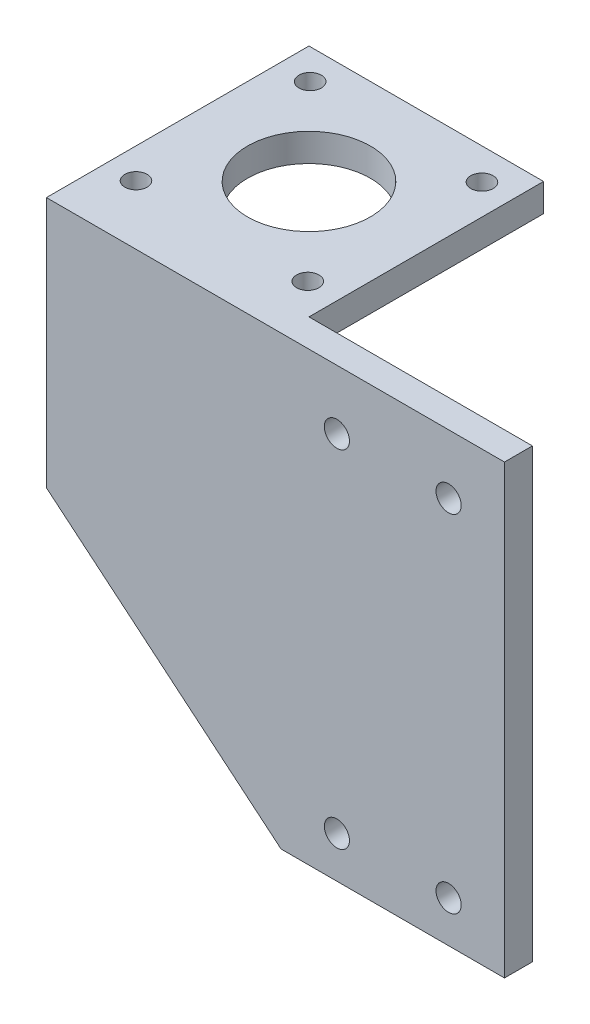
ISO-10303-21;
HEADER;
FILE_DESCRIPTION(('STEP AP214'),'2;1');
FILE_NAME('part.step','',(''),(''),'','','');
FILE_SCHEMA(('AUTOMOTIVE_DESIGN { 1 0 10303 214 1 1 1 1 }'));
ENDSEC;
DATA;
#1=APPLICATION_CONTEXT('core data for automotive mechanical design processes');
#2=APPLICATION_PROTOCOL_DEFINITION('international standard','automotive_design',2000,#1);
#3=PRODUCT_CONTEXT('',#1,'mechanical');
#4=PRODUCT('Part','Part','',(#3));
#5=PRODUCT_RELATED_PRODUCT_CATEGORY('part','',(#4));
#6=PRODUCT_DEFINITION_FORMATION('','',#4);
#7=PRODUCT_DEFINITION_CONTEXT('part definition',#1,'design');
#8=PRODUCT_DEFINITION('design','',#6,#7);
#9=PRODUCT_DEFINITION_SHAPE('','',#8);
#10=(LENGTH_UNIT() NAMED_UNIT(*) SI_UNIT(.MILLI.,.METRE.));
#11=(NAMED_UNIT(*) PLANE_ANGLE_UNIT() SI_UNIT($,.RADIAN.));
#12=(NAMED_UNIT(*) SI_UNIT($,.STERADIAN.) SOLID_ANGLE_UNIT());
#13=UNCERTAINTY_MEASURE_WITH_UNIT(LENGTH_MEASURE(1.E-05),#10,'distance_accuracy_value','');
#14=(GEOMETRIC_REPRESENTATION_CONTEXT(3) GLOBAL_UNCERTAINTY_ASSIGNED_CONTEXT((#13)) GLOBAL_UNIT_ASSIGNED_CONTEXT((#10,
#11,#12)) REPRESENTATION_CONTEXT('',''));
#15=CARTESIAN_POINT('',(0.,0.,0.));
#16=DIRECTION('',(0.,0.,1.));
#17=DIRECTION('',(1.,0.,0.));
#18=AXIS2_PLACEMENT_3D('',#15,#16,#17);
#19=CARTESIAN_POINT('',(0.,5.,0.));
#20=DIRECTION('',(0.,-1.,0.));
#21=DIRECTION('',(0.,0.,-1.));
#22=AXIS2_PLACEMENT_3D('',#19,#20,#21);
#23=PLANE('',#22);
#24=DIRECTION('',(0.,0.,-1.));
#25=VECTOR('',#24,1.);
#26=CARTESIAN_POINT('',(21.,5.,21.));
#27=LINE('',#26,#25);
#28=CARTESIAN_POINT('',(21.,5.,21.));
#29=VERTEX_POINT('',#28);
#30=CARTESIAN_POINT('',(21.,5.,-21.));
#31=VERTEX_POINT('',#30);
#32=EDGE_CURVE('E83',#29,#31,#27,.T.);
#33=ORIENTED_EDGE('',*,*,#32,.T.);
#34=DIRECTION('',(-1.,0.,0.));
#35=VECTOR('',#34,1.);
#36=CARTESIAN_POINT('',(-21.,5.,-21.));
#37=LINE('',#36,#35);
#38=CARTESIAN_POINT('',(-21.,5.,-21.));
#39=VERTEX_POINT('',#38);
#40=EDGE_CURVE('E50',#31,#39,#37,.T.);
#41=ORIENTED_EDGE('',*,*,#40,.T.);
#42=DIRECTION('',(0.,0.,1.));
#43=VECTOR('',#42,1.);
#44=CARTESIAN_POINT('',(-21.,5.,21.));
#45=LINE('',#44,#43);
#46=CARTESIAN_POINT('',(-21.,5.,26.));
#47=VERTEX_POINT('',#46);
#48=EDGE_CURVE('E91',#39,#47,#45,.T.);
#49=ORIENTED_EDGE('',*,*,#48,.T.);
#50=DIRECTION('',(-1.,0.,0.));
#51=VECTOR('',#50,1.);
#52=CARTESIAN_POINT('',(-21.,5.,26.));
#53=LINE('',#52,#51);
#54=CARTESIAN_POINT('',(61.,5.,26.));
#55=VERTEX_POINT('',#54);
#56=EDGE_CURVE('E153',#55,#47,#53,.T.);
#57=ORIENTED_EDGE('',*,*,#56,.F.);
#58=DIRECTION('',(0.,0.,-1.));
#59=VECTOR('',#58,1.);
#60=CARTESIAN_POINT('',(61.,5.,26.));
#61=LINE('',#60,#59);
#62=CARTESIAN_POINT('',(61.,5.,21.));
#63=VERTEX_POINT('',#62);
#64=EDGE_CURVE('E149',#55,#63,#61,.T.);
#65=ORIENTED_EDGE('',*,*,#64,.T.);
#66=DIRECTION('',(-1.,0.,0.));
#67=VECTOR('',#66,1.);
#68=CARTESIAN_POINT('',(21.,5.,21.));
#69=LINE('',#68,#67);
#70=EDGE_CURVE('E111',#63,#29,#69,.T.);
#71=ORIENTED_EDGE('',*,*,#70,.T.);
#72=EDGE_LOOP('',(#33,#41,#49,#57,#65,#71));
#73=FACE_BOUND('',#72,.T.);
#74=CARTESIAN_POINT('',(0.,5.,0.));
#75=DIRECTION('',(0.,1.,0.));
#76=DIRECTION('',(0.,0.,1.));
#77=AXIS2_PLACEMENT_3D('',#74,#75,#76);
#78=CIRCLE('',#77,11.);
#79=CARTESIAN_POINT('',(0.,5.,11.));
#80=VERTEX_POINT('',#79);
#81=EDGE_CURVE('E95',#80,#80,#78,.T.);
#82=ORIENTED_EDGE('',*,*,#81,.F.);
#83=EDGE_LOOP('',(#82));
#84=FACE_BOUND('',#83,.T.);
#85=CARTESIAN_POINT('',(-15.592519129157,5.,15.3780150606921));
#86=DIRECTION('',(0.,1.,0.));
#87=DIRECTION('',(0.,0.,1.));
#88=AXIS2_PLACEMENT_3D('',#85,#86,#87);
#89=CIRCLE('',#88,2.);
#90=CARTESIAN_POINT('',(-15.592519129157,5.,17.3780150606921));
#91=VERTEX_POINT('',#90);
#92=EDGE_CURVE('E115',#91,#91,#89,.T.);
#93=ORIENTED_EDGE('',*,*,#92,.F.);
#94=EDGE_LOOP('',(#93));
#95=FACE_BOUND('',#94,.T.);
#96=CARTESIAN_POINT('',(-15.3780150606921,5.,-15.592519129157));
#97=DIRECTION('',(0.,1.,0.));
#98=DIRECTION('',(0.,0.,1.));
#99=AXIS2_PLACEMENT_3D('',#96,#97,#98);
#100=CIRCLE('',#99,2.);
#101=CARTESIAN_POINT('',(-15.3780150606921,5.,-13.592519129157));
#102=VERTEX_POINT('',#101);
#103=EDGE_CURVE('E120',#102,#102,#100,.T.);
#104=ORIENTED_EDGE('',*,*,#103,.F.);
#105=EDGE_LOOP('',(#104));
#106=FACE_BOUND('',#105,.T.);
#107=CARTESIAN_POINT('',(15.592519129157,5.,-15.3780150606921));
#108=DIRECTION('',(0.,1.,0.));
#109=DIRECTION('',(0.,0.,1.));
#110=AXIS2_PLACEMENT_3D('',#107,#108,#109);
#111=CIRCLE('',#110,2.);
#112=CARTESIAN_POINT('',(15.592519129157,5.,-13.3780150606921));
#113=VERTEX_POINT('',#112);
#114=EDGE_CURVE('E126',#113,#113,#111,.T.);
#115=ORIENTED_EDGE('',*,*,#114,.F.);
#116=EDGE_LOOP('',(#115));
#117=FACE_BOUND('',#116,.T.);
#118=CARTESIAN_POINT('',(15.3780150606921,5.,15.592519129157));
#119=DIRECTION('',(0.,1.,0.));
#120=DIRECTION('',(0.,0.,1.));
#121=AXIS2_PLACEMENT_3D('',#118,#119,#120);
#122=CIRCLE('',#121,2.);
#123=CARTESIAN_POINT('',(15.3780150606921,5.,17.592519129157));
#124=VERTEX_POINT('',#123);
#125=EDGE_CURVE('E132',#124,#124,#122,.T.);
#126=ORIENTED_EDGE('',*,*,#125,.F.);
#127=EDGE_LOOP('',(#126));
#128=FACE_BOUND('',#127,.T.);
#129=ADVANCED_FACE('F33',(#73,#84,#95,#106,#117,#128),#23,.F.);
#130=CARTESIAN_POINT('',(0.,0.,0.));
#131=DIRECTION('',(0.,-1.,0.));
#132=DIRECTION('',(0.,0.,-1.));
#133=AXIS2_PLACEMENT_3D('',#130,#131,#132);
#134=PLANE('',#133);
#135=CARTESIAN_POINT('',(15.592519129157,0.,-15.3780150606921));
#136=DIRECTION('',(0.,1.,0.));
#137=DIRECTION('',(0.,0.,1.));
#138=AXIS2_PLACEMENT_3D('',#135,#136,#137);
#139=CIRCLE('',#138,2.);
#140=CARTESIAN_POINT('',(15.592519129157,0.,-13.3780150606921));
#141=VERTEX_POINT('',#140);
#142=EDGE_CURVE('E129',#141,#141,#139,.T.);
#143=ORIENTED_EDGE('',*,*,#142,.T.);
#144=EDGE_LOOP('',(#143));
#145=FACE_BOUND('',#144,.T.);
#146=CARTESIAN_POINT('',(-15.592519129157,0.,15.3780150606921));
#147=DIRECTION('',(0.,1.,0.));
#148=DIRECTION('',(0.,0.,1.));
#149=AXIS2_PLACEMENT_3D('',#146,#147,#148);
#150=CIRCLE('',#149,2.);
#151=CARTESIAN_POINT('',(-15.592519129157,0.,17.3780150606921));
#152=VERTEX_POINT('',#151);
#153=EDGE_CURVE('E117',#152,#152,#150,.T.);
#154=ORIENTED_EDGE('',*,*,#153,.T.);
#155=EDGE_LOOP('',(#154));
#156=FACE_BOUND('',#155,.T.);
#157=DIRECTION('',(0.,0.,-1.));
#158=VECTOR('',#157,1.);
#159=CARTESIAN_POINT('',(21.,0.,21.));
#160=LINE('',#159,#158);
#161=CARTESIAN_POINT('',(21.,0.,21.));
#162=VERTEX_POINT('',#161);
#163=CARTESIAN_POINT('',(21.,0.,-21.));
#164=VERTEX_POINT('',#163);
#165=EDGE_CURVE('E90',#162,#164,#160,.T.);
#166=ORIENTED_EDGE('',*,*,#165,.F.);
#167=DIRECTION('',(1.,0.,0.));
#168=VECTOR('',#167,1.);
#169=CARTESIAN_POINT('',(-21.,0.,21.));
#170=LINE('',#169,#168);
#171=CARTESIAN_POINT('',(-21.,0.,21.));
#172=VERTEX_POINT('',#171);
#173=EDGE_CURVE('E68',#172,#162,#170,.T.);
#174=ORIENTED_EDGE('',*,*,#173,.F.);
#175=DIRECTION('',(0.,0.,1.));
#176=VECTOR('',#175,1.);
#177=CARTESIAN_POINT('',(-21.,0.,21.));
#178=LINE('',#177,#176);
#179=CARTESIAN_POINT('',(-21.,0.,-21.));
#180=VERTEX_POINT('',#179);
#181=EDGE_CURVE('E84',#180,#172,#178,.T.);
#182=ORIENTED_EDGE('',*,*,#181,.F.);
#183=DIRECTION('',(-1.,0.,0.));
#184=VECTOR('',#183,1.);
#185=CARTESIAN_POINT('',(-21.,0.,-21.));
#186=LINE('',#185,#184);
#187=EDGE_CURVE('E61',#164,#180,#186,.T.);
#188=ORIENTED_EDGE('',*,*,#187,.F.);
#189=EDGE_LOOP('',(#166,#174,#182,#188));
#190=FACE_BOUND('',#189,.T.);
#191=CARTESIAN_POINT('',(0.,0.,0.));
#192=DIRECTION('',(0.,1.,0.));
#193=DIRECTION('',(0.,0.,1.));
#194=AXIS2_PLACEMENT_3D('',#191,#192,#193);
#195=CIRCLE('',#194,11.);
#196=CARTESIAN_POINT('',(0.,0.,11.));
#197=VERTEX_POINT('',#196);
#198=EDGE_CURVE('E99',#197,#197,#195,.T.);
#199=ORIENTED_EDGE('',*,*,#198,.T.);
#200=EDGE_LOOP('',(#199));
#201=FACE_BOUND('',#200,.T.);
#202=CARTESIAN_POINT('',(-15.3780150606921,0.,-15.592519129157));
#203=DIRECTION('',(0.,1.,0.));
#204=DIRECTION('',(0.,0.,1.));
#205=AXIS2_PLACEMENT_3D('',#202,#203,#204);
#206=CIRCLE('',#205,2.);
#207=CARTESIAN_POINT('',(-15.3780150606921,0.,-13.592519129157));
#208=VERTEX_POINT('',#207);
#209=EDGE_CURVE('E123',#208,#208,#206,.T.);
#210=ORIENTED_EDGE('',*,*,#209,.T.);
#211=EDGE_LOOP('',(#210));
#212=FACE_BOUND('',#211,.T.);
#213=CARTESIAN_POINT('',(15.3780150606921,0.,15.592519129157));
#214=DIRECTION('',(0.,1.,0.));
#215=DIRECTION('',(0.,0.,1.));
#216=AXIS2_PLACEMENT_3D('',#213,#214,#215);
#217=CIRCLE('',#216,2.);
#218=CARTESIAN_POINT('',(15.3780150606921,0.,17.592519129157));
#219=VERTEX_POINT('',#218);
#220=EDGE_CURVE('E135',#219,#219,#217,.T.);
#221=ORIENTED_EDGE('',*,*,#220,.T.);
#222=EDGE_LOOP('',(#221));
#223=FACE_BOUND('',#222,.T.);
#224=ADVANCED_FACE('F93',(#145,#156,#190,#201,#212,#223),#134,.T.);
#225=CARTESIAN_POINT('',(21.,5.,21.));
#226=DIRECTION('',(-1.,0.,0.));
#227=DIRECTION('',(0.,0.,1.));
#228=AXIS2_PLACEMENT_3D('',#225,#226,#227);
#229=PLANE('',#228);
#230=ORIENTED_EDGE('',*,*,#165,.T.);
#231=DIRECTION('',(0.,-1.,0.));
#232=VECTOR('',#231,1.);
#233=CARTESIAN_POINT('',(21.,5.,-21.));
#234=LINE('',#233,#232);
#235=EDGE_CURVE('E11',#31,#164,#234,.T.);
#236=ORIENTED_EDGE('',*,*,#235,.F.);
#237=ORIENTED_EDGE('',*,*,#32,.F.);
#238=DIRECTION('',(0.,-1.,0.));
#239=VECTOR('',#238,1.);
#240=CARTESIAN_POINT('',(21.,5.,21.));
#241=LINE('',#240,#239);
#242=EDGE_CURVE('E73',#29,#162,#241,.T.);
#243=ORIENTED_EDGE('',*,*,#242,.T.);
#244=EDGE_LOOP('',(#230,#236,#237,#243));
#245=FACE_BOUND('',#244,.T.);
#246=ADVANCED_FACE('F35',(#245),#229,.F.);
#247=CARTESIAN_POINT('',(-21.,5.,-21.));
#248=DIRECTION('',(0.,0.,1.));
#249=DIRECTION('',(1.,0.,0.));
#250=AXIS2_PLACEMENT_3D('',#247,#248,#249);
#251=PLANE('',#250);
#252=ORIENTED_EDGE('',*,*,#187,.T.);
#253=DIRECTION('',(0.,-1.,0.));
#254=VECTOR('',#253,1.);
#255=CARTESIAN_POINT('',(-21.,5.,-21.));
#256=LINE('',#255,#254);
#257=EDGE_CURVE('E42',#39,#180,#256,.T.);
#258=ORIENTED_EDGE('',*,*,#257,.F.);
#259=ORIENTED_EDGE('',*,*,#40,.F.);
#260=ORIENTED_EDGE('',*,*,#235,.T.);
#261=EDGE_LOOP('',(#252,#258,#259,#260));
#262=FACE_BOUND('',#261,.T.);
#263=ADVANCED_FACE('F108',(#262),#251,.F.);
#264=CARTESIAN_POINT('',(-21.,5.,21.));
#265=DIRECTION('',(1.,0.,0.));
#266=DIRECTION('',(0.,0.,-1.));
#267=AXIS2_PLACEMENT_3D('',#264,#265,#266);
#268=PLANE('',#267);
#269=ORIENTED_EDGE('',*,*,#181,.T.);
#270=DIRECTION('',(0.,-1.,0.));
#271=VECTOR('',#270,1.);
#272=CARTESIAN_POINT('',(-21.,0.,21.));
#273=LINE('',#272,#271);
#274=CARTESIAN_POINT('',(-21.,-40.,21.));
#275=VERTEX_POINT('',#274);
#276=EDGE_CURVE('E78',#172,#275,#273,.T.);
#277=ORIENTED_EDGE('',*,*,#276,.T.);
#278=DIRECTION('',(0.,0.,-1.));
#279=VECTOR('',#278,1.);
#280=CARTESIAN_POINT('',(-21.,-40.,26.));
#281=LINE('',#280,#279);
#282=CARTESIAN_POINT('',(-21.,-40.,26.));
#283=VERTEX_POINT('',#282);
#284=EDGE_CURVE('E138',#283,#275,#281,.T.);
#285=ORIENTED_EDGE('',*,*,#284,.F.);
#286=DIRECTION('',(0.,-1.,0.));
#287=VECTOR('',#286,1.);
#288=CARTESIAN_POINT('',(-21.,0.,26.));
#289=LINE('',#288,#287);
#290=EDGE_CURVE('E173',#47,#283,#289,.T.);
#291=ORIENTED_EDGE('',*,*,#290,.F.);
#292=ORIENTED_EDGE('',*,*,#48,.F.);
#293=ORIENTED_EDGE('',*,*,#257,.T.);
#294=EDGE_LOOP('',(#269,#277,#285,#291,#292,#293));
#295=FACE_BOUND('',#294,.T.);
#296=ADVANCED_FACE('F106',(#295),#268,.F.);
#297=CARTESIAN_POINT('',(0.,5.,0.));
#298=DIRECTION('',(0.,-1.,0.));
#299=DIRECTION('',(0.,0.,-1.));
#300=AXIS2_PLACEMENT_3D('',#297,#298,#299);
#301=CYLINDRICAL_SURFACE('',#300,11.);
#302=ORIENTED_EDGE('',*,*,#81,.T.);
#303=EDGE_LOOP('',(#302));
#304=FACE_BOUND('',#303,.T.);
#305=ORIENTED_EDGE('',*,*,#198,.F.);
#306=EDGE_LOOP('',(#305));
#307=FACE_BOUND('',#306,.T.);
#308=ADVANCED_FACE('F230',(#304,#307),#301,.F.);
#309=CARTESIAN_POINT('',(-15.592519129157,5.,15.3780150606921));
#310=DIRECTION('',(0.,-1.,0.));
#311=DIRECTION('',(0.,0.,-1.));
#312=AXIS2_PLACEMENT_3D('',#309,#310,#311);
#313=CYLINDRICAL_SURFACE('',#312,2.);
#314=ORIENTED_EDGE('',*,*,#92,.T.);
#315=EDGE_LOOP('',(#314));
#316=FACE_BOUND('',#315,.T.);
#317=ORIENTED_EDGE('',*,*,#153,.F.);
#318=EDGE_LOOP('',(#317));
#319=FACE_BOUND('',#318,.T.);
#320=ADVANCED_FACE('F277',(#316,#319),#313,.F.);
#321=CARTESIAN_POINT('',(-15.3780150606921,5.,-15.592519129157));
#322=DIRECTION('',(0.,-1.,0.));
#323=DIRECTION('',(0.,0.,-1.));
#324=AXIS2_PLACEMENT_3D('',#321,#322,#323);
#325=CYLINDRICAL_SURFACE('',#324,2.);
#326=ORIENTED_EDGE('',*,*,#103,.T.);
#327=EDGE_LOOP('',(#326));
#328=FACE_BOUND('',#327,.T.);
#329=ORIENTED_EDGE('',*,*,#209,.F.);
#330=EDGE_LOOP('',(#329));
#331=FACE_BOUND('',#330,.T.);
#332=ADVANCED_FACE('F267',(#328,#331),#325,.F.);
#333=CARTESIAN_POINT('',(15.592519129157,5.,-15.3780150606921));
#334=DIRECTION('',(0.,-1.,0.));
#335=DIRECTION('',(0.,0.,-1.));
#336=AXIS2_PLACEMENT_3D('',#333,#334,#335);
#337=CYLINDRICAL_SURFACE('',#336,2.);
#338=ORIENTED_EDGE('',*,*,#114,.T.);
#339=EDGE_LOOP('',(#338));
#340=FACE_BOUND('',#339,.T.);
#341=ORIENTED_EDGE('',*,*,#142,.F.);
#342=EDGE_LOOP('',(#341));
#343=FACE_BOUND('',#342,.T.);
#344=ADVANCED_FACE('F217',(#340,#343),#337,.F.);
#345=CARTESIAN_POINT('',(15.3780150606921,5.,15.592519129157));
#346=DIRECTION('',(0.,-1.,0.));
#347=DIRECTION('',(0.,0.,-1.));
#348=AXIS2_PLACEMENT_3D('',#345,#346,#347);
#349=CYLINDRICAL_SURFACE('',#348,2.);
#350=ORIENTED_EDGE('',*,*,#125,.T.);
#351=EDGE_LOOP('',(#350));
#352=FACE_BOUND('',#351,.T.);
#353=ORIENTED_EDGE('',*,*,#220,.F.);
#354=EDGE_LOOP('',(#353));
#355=FACE_BOUND('',#354,.T.);
#356=ADVANCED_FACE('F207',(#352,#355),#349,.F.);
#357=CARTESIAN_POINT('',(0.,0.,26.));
#358=DIRECTION('',(0.,0.,-1.));
#359=DIRECTION('',(-1.,0.,0.));
#360=AXIS2_PLACEMENT_3D('',#357,#358,#359);
#361=PLANE('',#360);
#362=ORIENTED_EDGE('',*,*,#56,.T.);
#363=ORIENTED_EDGE('',*,*,#290,.T.);
#364=DIRECTION('',(0.768221279597376,-0.64018439966448,0.));
#365=VECTOR('',#364,1.);
#366=CARTESIAN_POINT('',(-21.,-40.,26.));
#367=LINE('',#366,#365);
#368=CARTESIAN_POINT('',(21.,-75.,26.));
#369=VERTEX_POINT('',#368);
#370=EDGE_CURVE('E170',#283,#369,#367,.T.);
#371=ORIENTED_EDGE('',*,*,#370,.T.);
#372=DIRECTION('',(1.,0.,0.));
#373=VECTOR('',#372,1.);
#374=CARTESIAN_POINT('',(61.,-75.,26.));
#375=LINE('',#374,#373);
#376=CARTESIAN_POINT('',(61.,-75.,26.));
#377=VERTEX_POINT('',#376);
#378=EDGE_CURVE('E167',#369,#377,#375,.T.);
#379=ORIENTED_EDGE('',*,*,#378,.T.);
#380=DIRECTION('',(0.,1.,0.));
#381=VECTOR('',#380,1.);
#382=CARTESIAN_POINT('',(61.,5.,26.));
#383=LINE('',#382,#381);
#384=EDGE_CURVE('E151',#377,#55,#383,.T.);
#385=ORIENTED_EDGE('',*,*,#384,.T.);
#386=EDGE_LOOP('',(#362,#363,#371,#379,#385));
#387=FACE_BOUND('',#386,.T.);
#388=CARTESIAN_POINT('',(51.,-67.5818456079327,26.));
#389=DIRECTION('',(0.,0.,1.));
#390=DIRECTION('',(1.,0.,0.));
#391=AXIS2_PLACEMENT_3D('',#388,#389,#390);
#392=CIRCLE('',#391,2.25);
#393=CARTESIAN_POINT('',(53.25,-67.5818456079327,26.));
#394=VERTEX_POINT('',#393);
#395=EDGE_CURVE('E164',#394,#394,#392,.T.);
#396=ORIENTED_EDGE('',*,*,#395,.F.);
#397=EDGE_LOOP('',(#396));
#398=FACE_BOUND('',#397,.T.);
#399=CARTESIAN_POINT('',(31.,-67.5818456079327,26.));
#400=DIRECTION('',(0.,0.,1.));
#401=DIRECTION('',(1.,0.,0.));
#402=AXIS2_PLACEMENT_3D('',#399,#400,#401);
#403=CIRCLE('',#402,2.25);
#404=CARTESIAN_POINT('',(33.25,-67.5818456079327,26.));
#405=VERTEX_POINT('',#404);
#406=EDGE_CURVE('E181',#405,#405,#403,.T.);
#407=ORIENTED_EDGE('',*,*,#406,.F.);
#408=EDGE_LOOP('',(#407));
#409=FACE_BOUND('',#408,.T.);
#410=CARTESIAN_POINT('',(31.,-5.62734865596326,26.));
#411=DIRECTION('',(0.,0.,1.));
#412=DIRECTION('',(1.,0.,0.));
#413=AXIS2_PLACEMENT_3D('',#410,#411,#412);
#414=CIRCLE('',#413,2.25);
#415=CARTESIAN_POINT('',(33.25,-5.62734865596326,26.));
#416=VERTEX_POINT('',#415);
#417=EDGE_CURVE('E187',#416,#416,#414,.T.);
#418=ORIENTED_EDGE('',*,*,#417,.F.);
#419=EDGE_LOOP('',(#418));
#420=FACE_BOUND('',#419,.T.);
#421=CARTESIAN_POINT('',(51.,-5.62734865596326,26.));
#422=DIRECTION('',(0.,0.,1.));
#423=DIRECTION('',(1.,0.,0.));
#424=AXIS2_PLACEMENT_3D('',#421,#422,#423);
#425=CIRCLE('',#424,2.25);
#426=CARTESIAN_POINT('',(53.25,-5.62734865596326,26.));
#427=VERTEX_POINT('',#426);
#428=EDGE_CURVE('E193',#427,#427,#425,.T.);
#429=ORIENTED_EDGE('',*,*,#428,.F.);
#430=EDGE_LOOP('',(#429));
#431=FACE_BOUND('',#430,.T.);
#432=ADVANCED_FACE('F205',(#387,#398,#409,#420,#431),#361,.F.);
#433=CARTESIAN_POINT('',(0.,0.,21.));
#434=DIRECTION('',(0.,0.,-1.));
#435=DIRECTION('',(-1.,0.,0.));
#436=AXIS2_PLACEMENT_3D('',#433,#434,#435);
#437=PLANE('',#436);
#438=CARTESIAN_POINT('',(31.,-5.62734865596326,21.));
#439=DIRECTION('',(0.,0.,1.));
#440=DIRECTION('',(1.,0.,0.));
#441=AXIS2_PLACEMENT_3D('',#438,#439,#440);
#442=CIRCLE('',#441,2.25);
#443=CARTESIAN_POINT('',(33.25,-5.62734865596326,21.));
#444=VERTEX_POINT('',#443);
#445=EDGE_CURVE('E190',#444,#444,#442,.T.);
#446=ORIENTED_EDGE('',*,*,#445,.T.);
#447=EDGE_LOOP('',(#446));
#448=FACE_BOUND('',#447,.T.);
#449=CARTESIAN_POINT('',(51.,-67.5818456079327,21.));
#450=DIRECTION('',(0.,0.,1.));
#451=DIRECTION('',(1.,0.,0.));
#452=AXIS2_PLACEMENT_3D('',#449,#450,#451);
#453=CIRCLE('',#452,2.25);
#454=CARTESIAN_POINT('',(53.25,-67.5818456079327,21.));
#455=VERTEX_POINT('',#454);
#456=EDGE_CURVE('E178',#455,#455,#453,.T.);
#457=ORIENTED_EDGE('',*,*,#456,.T.);
#458=EDGE_LOOP('',(#457));
#459=FACE_BOUND('',#458,.T.);
#460=ORIENTED_EDGE('',*,*,#276,.F.);
#461=ORIENTED_EDGE('',*,*,#173,.T.);
#462=ORIENTED_EDGE('',*,*,#242,.F.);
#463=ORIENTED_EDGE('',*,*,#70,.F.);
#464=DIRECTION('',(0.,1.,0.));
#465=VECTOR('',#464,1.);
#466=CARTESIAN_POINT('',(61.,5.,21.));
#467=LINE('',#466,#465);
#468=CARTESIAN_POINT('',(61.,-75.,21.));
#469=VERTEX_POINT('',#468);
#470=EDGE_CURVE('E154',#469,#63,#467,.T.);
#471=ORIENTED_EDGE('',*,*,#470,.F.);
#472=DIRECTION('',(1.,0.,0.));
#473=VECTOR('',#472,1.);
#474=CARTESIAN_POINT('',(61.,-75.,21.));
#475=LINE('',#474,#473);
#476=CARTESIAN_POINT('',(21.,-75.,21.));
#477=VERTEX_POINT('',#476);
#478=EDGE_CURVE('E157',#477,#469,#475,.T.);
#479=ORIENTED_EDGE('',*,*,#478,.F.);
#480=DIRECTION('',(0.768221279597376,-0.64018439966448,0.));
#481=VECTOR('',#480,1.);
#482=CARTESIAN_POINT('',(-21.,-40.,21.));
#483=LINE('',#482,#481);
#484=EDGE_CURVE('E160',#275,#477,#483,.T.);
#485=ORIENTED_EDGE('',*,*,#484,.F.);
#486=EDGE_LOOP('',(#460,#461,#462,#463,#471,#479,#485));
#487=FACE_BOUND('',#486,.T.);
#488=CARTESIAN_POINT('',(31.,-67.5818456079327,21.));
#489=DIRECTION('',(0.,0.,1.));
#490=DIRECTION('',(1.,0.,0.));
#491=AXIS2_PLACEMENT_3D('',#488,#489,#490);
#492=CIRCLE('',#491,2.25);
#493=CARTESIAN_POINT('',(33.25,-67.5818456079327,21.));
#494=VERTEX_POINT('',#493);
#495=EDGE_CURVE('E184',#494,#494,#492,.T.);
#496=ORIENTED_EDGE('',*,*,#495,.T.);
#497=EDGE_LOOP('',(#496));
#498=FACE_BOUND('',#497,.T.);
#499=CARTESIAN_POINT('',(51.,-5.62734865596326,21.));
#500=DIRECTION('',(0.,0.,1.));
#501=DIRECTION('',(1.,0.,0.));
#502=AXIS2_PLACEMENT_3D('',#499,#500,#501);
#503=CIRCLE('',#502,2.25);
#504=CARTESIAN_POINT('',(53.25,-5.62734865596326,21.));
#505=VERTEX_POINT('',#504);
#506=EDGE_CURVE('E196',#505,#505,#503,.T.);
#507=ORIENTED_EDGE('',*,*,#506,.T.);
#508=EDGE_LOOP('',(#507));
#509=FACE_BOUND('',#508,.T.);
#510=ADVANCED_FACE('F70',(#448,#459,#487,#498,#509),#437,.T.);
#511=CARTESIAN_POINT('',(-21.,-40.,26.));
#512=DIRECTION('',(0.64018439966448,0.768221279597376,0.));
#513=DIRECTION('',(-0.768221279597376,0.64018439966448,0.));
#514=AXIS2_PLACEMENT_3D('',#511,#512,#513);
#515=PLANE('',#514);
#516=ORIENTED_EDGE('',*,*,#484,.T.);
#517=DIRECTION('',(0.,0.,-1.));
#518=VECTOR('',#517,1.);
#519=CARTESIAN_POINT('',(21.,-75.,26.));
#520=LINE('',#519,#518);
#521=EDGE_CURVE('E143',#369,#477,#520,.T.);
#522=ORIENTED_EDGE('',*,*,#521,.F.);
#523=ORIENTED_EDGE('',*,*,#370,.F.);
#524=ORIENTED_EDGE('',*,*,#284,.T.);
#525=EDGE_LOOP('',(#516,#522,#523,#524));
#526=FACE_BOUND('',#525,.T.);
#527=ADVANCED_FACE('F214',(#526),#515,.F.);
#528=CARTESIAN_POINT('',(61.,-75.,26.));
#529=DIRECTION('',(0.,1.,0.));
#530=DIRECTION('',(-1.,0.,0.));
#531=AXIS2_PLACEMENT_3D('',#528,#529,#530);
#532=PLANE('',#531);
#533=ORIENTED_EDGE('',*,*,#478,.T.);
#534=DIRECTION('',(0.,0.,-1.));
#535=VECTOR('',#534,1.);
#536=CARTESIAN_POINT('',(61.,-75.,26.));
#537=LINE('',#536,#535);
#538=EDGE_CURVE('E146',#377,#469,#537,.T.);
#539=ORIENTED_EDGE('',*,*,#538,.F.);
#540=ORIENTED_EDGE('',*,*,#378,.F.);
#541=ORIENTED_EDGE('',*,*,#521,.T.);
#542=EDGE_LOOP('',(#533,#539,#540,#541));
#543=FACE_BOUND('',#542,.T.);
#544=ADVANCED_FACE('F328',(#543),#532,.F.);
#545=CARTESIAN_POINT('',(61.,5.,26.));
#546=DIRECTION('',(-1.,0.,0.));
#547=DIRECTION('',(0.,-1.,0.));
#548=AXIS2_PLACEMENT_3D('',#545,#546,#547);
#549=PLANE('',#548);
#550=ORIENTED_EDGE('',*,*,#470,.T.);
#551=ORIENTED_EDGE('',*,*,#64,.F.);
#552=ORIENTED_EDGE('',*,*,#384,.F.);
#553=ORIENTED_EDGE('',*,*,#538,.T.);
#554=EDGE_LOOP('',(#550,#551,#552,#553));
#555=FACE_BOUND('',#554,.T.);
#556=ADVANCED_FACE('F337',(#555),#549,.F.);
#557=CARTESIAN_POINT('',(51.,-67.5818456079327,26.));
#558=DIRECTION('',(0.,0.,-1.));
#559=DIRECTION('',(-1.,0.,0.));
#560=AXIS2_PLACEMENT_3D('',#557,#558,#559);
#561=CYLINDRICAL_SURFACE('',#560,2.25);
#562=ORIENTED_EDGE('',*,*,#395,.T.);
#563=EDGE_LOOP('',(#562));
#564=FACE_BOUND('',#563,.T.);
#565=ORIENTED_EDGE('',*,*,#456,.F.);
#566=EDGE_LOOP('',(#565));
#567=FACE_BOUND('',#566,.T.);
#568=ADVANCED_FACE('F346',(#564,#567),#561,.F.);
#569=CARTESIAN_POINT('',(31.,-67.5818456079327,26.));
#570=DIRECTION('',(0.,0.,-1.));
#571=DIRECTION('',(-1.,0.,0.));
#572=AXIS2_PLACEMENT_3D('',#569,#570,#571);
#573=CYLINDRICAL_SURFACE('',#572,2.25);
#574=ORIENTED_EDGE('',*,*,#406,.T.);
#575=EDGE_LOOP('',(#574));
#576=FACE_BOUND('',#575,.T.);
#577=ORIENTED_EDGE('',*,*,#495,.F.);
#578=EDGE_LOOP('',(#577));
#579=FACE_BOUND('',#578,.T.);
#580=ADVANCED_FACE('F355',(#576,#579),#573,.F.);
#581=CARTESIAN_POINT('',(31.,-5.62734865596326,26.));
#582=DIRECTION('',(0.,0.,-1.));
#583=DIRECTION('',(-1.,0.,0.));
#584=AXIS2_PLACEMENT_3D('',#581,#582,#583);
#585=CYLINDRICAL_SURFACE('',#584,2.25);
#586=ORIENTED_EDGE('',*,*,#417,.T.);
#587=EDGE_LOOP('',(#586));
#588=FACE_BOUND('',#587,.T.);
#589=ORIENTED_EDGE('',*,*,#445,.F.);
#590=EDGE_LOOP('',(#589));
#591=FACE_BOUND('',#590,.T.);
#592=ADVANCED_FACE('F363',(#588,#591),#585,.F.);
#593=CARTESIAN_POINT('',(51.,-5.62734865596326,26.));
#594=DIRECTION('',(0.,0.,-1.));
#595=DIRECTION('',(-1.,0.,0.));
#596=AXIS2_PLACEMENT_3D('',#593,#594,#595);
#597=CYLINDRICAL_SURFACE('',#596,2.25);
#598=ORIENTED_EDGE('',*,*,#428,.T.);
#599=EDGE_LOOP('',(#598));
#600=FACE_BOUND('',#599,.T.);
#601=ORIENTED_EDGE('',*,*,#506,.F.);
#602=EDGE_LOOP('',(#601));
#603=FACE_BOUND('',#602,.T.);
#604=ADVANCED_FACE('F202',(#600,#603),#597,.F.);
#605=CLOSED_SHELL('',(#129,#224,#246,#263,#296,#308,#320,#332,#344,#356,#432,#510,#527,#544,
#556,#568,#580,#592,#604));
#606=MANIFOLD_SOLID_BREP('B2',#605);
#607=ADVANCED_BREP_SHAPE_REPRESENTATION('',(#18,#606),#14);
#608=SHAPE_DEFINITION_REPRESENTATION(#9,#607);
ENDSEC;
END-ISO-10303-21;
